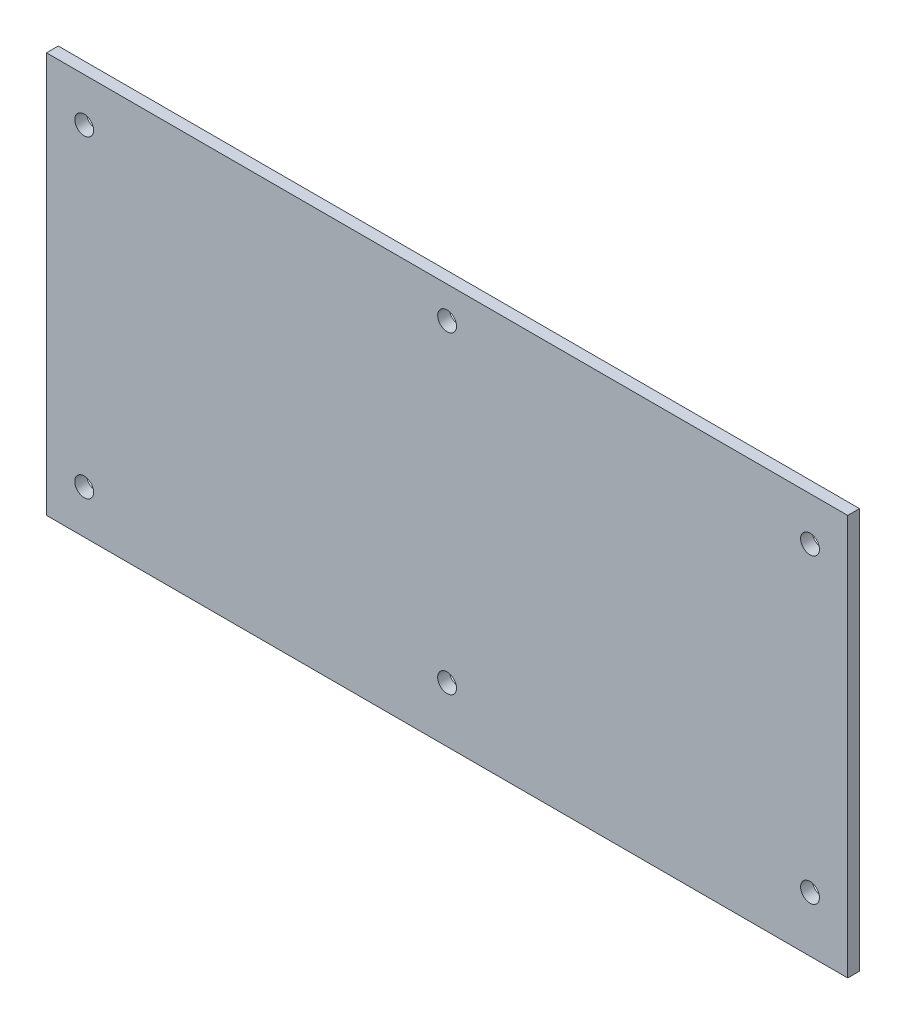
ISO-10303-21;
HEADER;
FILE_DESCRIPTION(('STEP AP214'),'2;1');
FILE_NAME('part.step','',(''),(''),'','','');
FILE_SCHEMA(('AUTOMOTIVE_DESIGN { 1 0 10303 214 1 1 1 1 }'));
ENDSEC;
DATA;
#1=APPLICATION_CONTEXT('core data for automotive mechanical design processes');
#2=APPLICATION_PROTOCOL_DEFINITION('international standard','automotive_design',2000,#1);
#3=PRODUCT_CONTEXT('',#1,'mechanical');
#4=PRODUCT('Part','Part','',(#3));
#5=PRODUCT_RELATED_PRODUCT_CATEGORY('part','',(#4));
#6=PRODUCT_DEFINITION_FORMATION('','',#4);
#7=PRODUCT_DEFINITION_CONTEXT('part definition',#1,'design');
#8=PRODUCT_DEFINITION('design','',#6,#7);
#9=PRODUCT_DEFINITION_SHAPE('','',#8);
#10=(LENGTH_UNIT() NAMED_UNIT(*) SI_UNIT(.MILLI.,.METRE.));
#11=(NAMED_UNIT(*) PLANE_ANGLE_UNIT() SI_UNIT($,.RADIAN.));
#12=(NAMED_UNIT(*) SI_UNIT($,.STERADIAN.) SOLID_ANGLE_UNIT());
#13=UNCERTAINTY_MEASURE_WITH_UNIT(LENGTH_MEASURE(1.E-05),#10,'distance_accuracy_value','');
#14=(GEOMETRIC_REPRESENTATION_CONTEXT(3) GLOBAL_UNCERTAINTY_ASSIGNED_CONTEXT((#13)) GLOBAL_UNIT_ASSIGNED_CONTEXT((#10,
#11,#12)) REPRESENTATION_CONTEXT('',''));
#15=CARTESIAN_POINT('',(0.,0.,0.));
#16=DIRECTION('',(0.,0.,1.));
#17=DIRECTION('',(1.,0.,0.));
#18=AXIS2_PLACEMENT_3D('',#15,#16,#17);
#19=CARTESIAN_POINT('',(0.,0.,5.));
#20=DIRECTION('',(0.,0.,-1.));
#21=DIRECTION('',(-1.,0.,0.));
#22=AXIS2_PLACEMENT_3D('',#19,#20,#21);
#23=PLANE('',#22);
#24=DIRECTION('',(0.,1.,0.));
#25=VECTOR('',#24,1.);
#26=CARTESIAN_POINT('',(137.134920634921,48.2341269841271,5.));
#27=LINE('',#26,#25);
#28=CARTESIAN_POINT('',(137.134920634921,-121.765873015873,5.));
#29=VERTEX_POINT('',#28);
#30=CARTESIAN_POINT('',(137.134920634921,48.2341269841271,5.));
#31=VERTEX_POINT('',#30);
#32=EDGE_CURVE('E86',#29,#31,#27,.T.);
#33=ORIENTED_EDGE('',*,*,#32,.T.);
#34=DIRECTION('',(-1.,0.,0.));
#35=VECTOR('',#34,1.);
#36=CARTESIAN_POINT('',(137.134920634921,48.2341269841271,5.));
#37=LINE('',#36,#35);
#38=CARTESIAN_POINT('',(-202.865079365079,48.234126984127,5.));
#39=VERTEX_POINT('',#38);
#40=EDGE_CURVE('E81',#31,#39,#37,.T.);
#41=ORIENTED_EDGE('',*,*,#40,.T.);
#42=DIRECTION('',(0.,-1.,0.));
#43=VECTOR('',#42,1.);
#44=CARTESIAN_POINT('',(-202.865079365079,48.234126984127,5.));
#45=LINE('',#44,#43);
#46=CARTESIAN_POINT('',(-202.865079365079,-121.765873015873,5.));
#47=VERTEX_POINT('',#46);
#48=EDGE_CURVE('E84',#39,#47,#45,.T.);
#49=ORIENTED_EDGE('',*,*,#48,.T.);
#50=DIRECTION('',(1.,0.,0.));
#51=VECTOR('',#50,1.);
#52=CARTESIAN_POINT('',(137.134920634921,-121.765873015873,5.));
#53=LINE('',#52,#51);
#54=EDGE_CURVE('E51',#47,#29,#53,.T.);
#55=ORIENTED_EDGE('',*,*,#54,.T.);
#56=EDGE_LOOP('',(#33,#41,#49,#55));
#57=FACE_BOUND('',#56,.T.);
#58=CARTESIAN_POINT('',(121.134920634921,29.7341269841271,5.));
#59=DIRECTION('',(0.,0.,1.));
#60=DIRECTION('',(1.,0.,0.));
#61=AXIS2_PLACEMENT_3D('',#58,#59,#60);
#62=CIRCLE('',#61,4.00000000000001);
#63=CARTESIAN_POINT('',(125.134920634921,29.7341269841271,5.));
#64=VERTEX_POINT('',#63);
#65=EDGE_CURVE('E101',#64,#64,#62,.T.);
#66=ORIENTED_EDGE('',*,*,#65,.F.);
#67=EDGE_LOOP('',(#66));
#68=FACE_BOUND('',#67,.T.);
#69=CARTESIAN_POINT('',(-32.8650793650793,34.734126984127,5.));
#70=DIRECTION('',(0.,0.,1.));
#71=DIRECTION('',(1.,0.,0.));
#72=AXIS2_PLACEMENT_3D('',#69,#70,#71);
#73=CIRCLE('',#72,4.);
#74=CARTESIAN_POINT('',(-28.8650793650793,34.734126984127,5.));
#75=VERTEX_POINT('',#74);
#76=EDGE_CURVE('E116',#75,#75,#73,.T.);
#77=ORIENTED_EDGE('',*,*,#76,.F.);
#78=EDGE_LOOP('',(#77));
#79=FACE_BOUND('',#78,.T.);
#80=CARTESIAN_POINT('',(-186.865079365079,29.734126984127,5.));
#81=DIRECTION('',(0.,0.,1.));
#82=DIRECTION('',(1.,0.,0.));
#83=AXIS2_PLACEMENT_3D('',#80,#81,#82);
#84=CIRCLE('',#83,3.99999999999999);
#85=CARTESIAN_POINT('',(-182.865079365079,29.734126984127,5.));
#86=VERTEX_POINT('',#85);
#87=EDGE_CURVE('E122',#86,#86,#84,.T.);
#88=ORIENTED_EDGE('',*,*,#87,.F.);
#89=EDGE_LOOP('',(#88));
#90=FACE_BOUND('',#89,.T.);
#91=CARTESIAN_POINT('',(-186.865079365079,-103.265873015873,5.));
#92=DIRECTION('',(0.,0.,1.));
#93=DIRECTION('',(1.,0.,0.));
#94=AXIS2_PLACEMENT_3D('',#91,#92,#93);
#95=CIRCLE('',#94,3.99999999999999);
#96=CARTESIAN_POINT('',(-182.865079365079,-103.265873015873,5.));
#97=VERTEX_POINT('',#96);
#98=EDGE_CURVE('E128',#97,#97,#95,.T.);
#99=ORIENTED_EDGE('',*,*,#98,.F.);
#100=EDGE_LOOP('',(#99));
#101=FACE_BOUND('',#100,.T.);
#102=CARTESIAN_POINT('',(-32.8650793650793,-98.265873015873,5.));
#103=DIRECTION('',(0.,0.,1.));
#104=DIRECTION('',(1.,0.,0.));
#105=AXIS2_PLACEMENT_3D('',#102,#103,#104);
#106=CIRCLE('',#105,4.);
#107=CARTESIAN_POINT('',(-28.8650793650793,-98.265873015873,5.));
#108=VERTEX_POINT('',#107);
#109=EDGE_CURVE('E134',#108,#108,#106,.T.);
#110=ORIENTED_EDGE('',*,*,#109,.F.);
#111=EDGE_LOOP('',(#110));
#112=FACE_BOUND('',#111,.T.);
#113=CARTESIAN_POINT('',(121.134920634921,-98.265873015873,5.));
#114=DIRECTION('',(0.,0.,1.));
#115=DIRECTION('',(1.,0.,0.));
#116=AXIS2_PLACEMENT_3D('',#113,#114,#115);
#117=CIRCLE('',#116,3.99999999999999);
#118=CARTESIAN_POINT('',(125.134920634921,-98.265873015873,5.));
#119=VERTEX_POINT('',#118);
#120=EDGE_CURVE('E140',#119,#119,#117,.T.);
#121=ORIENTED_EDGE('',*,*,#120,.F.);
#122=EDGE_LOOP('',(#121));
#123=FACE_BOUND('',#122,.T.);
#124=ADVANCED_FACE('F34',(#57,#68,#79,#90,#101,#112,#123),#23,.F.);
#125=CARTESIAN_POINT('',(0.,0.,0.));
#126=DIRECTION('',(0.,0.,-1.));
#127=DIRECTION('',(-1.,0.,0.));
#128=AXIS2_PLACEMENT_3D('',#125,#126,#127);
#129=PLANE('',#128);
#130=CARTESIAN_POINT('',(-32.8650793650793,-98.265873015873,0.));
#131=DIRECTION('',(0.,0.,1.));
#132=DIRECTION('',(1.,0.,0.));
#133=AXIS2_PLACEMENT_3D('',#130,#131,#132);
#134=CIRCLE('',#133,4.);
#135=CARTESIAN_POINT('',(-28.8650793650793,-98.265873015873,0.));
#136=VERTEX_POINT('',#135);
#137=EDGE_CURVE('E137',#136,#136,#134,.T.);
#138=ORIENTED_EDGE('',*,*,#137,.T.);
#139=EDGE_LOOP('',(#138));
#140=FACE_BOUND('',#139,.T.);
#141=CARTESIAN_POINT('',(-186.865079365079,29.734126984127,0.));
#142=DIRECTION('',(0.,0.,1.));
#143=DIRECTION('',(1.,0.,0.));
#144=AXIS2_PLACEMENT_3D('',#141,#142,#143);
#145=CIRCLE('',#144,3.99999999999999);
#146=CARTESIAN_POINT('',(-182.865079365079,29.734126984127,0.));
#147=VERTEX_POINT('',#146);
#148=EDGE_CURVE('E125',#147,#147,#145,.T.);
#149=ORIENTED_EDGE('',*,*,#148,.T.);
#150=EDGE_LOOP('',(#149));
#151=FACE_BOUND('',#150,.T.);
#152=CARTESIAN_POINT('',(121.134920634921,29.7341269841271,0.));
#153=DIRECTION('',(0.,0.,1.));
#154=DIRECTION('',(1.,0.,0.));
#155=AXIS2_PLACEMENT_3D('',#152,#153,#154);
#156=CIRCLE('',#155,4.00000000000001);
#157=CARTESIAN_POINT('',(125.134920634921,29.7341269841271,0.));
#158=VERTEX_POINT('',#157);
#159=EDGE_CURVE('E113',#158,#158,#156,.T.);
#160=ORIENTED_EDGE('',*,*,#159,.T.);
#161=EDGE_LOOP('',(#160));
#162=FACE_BOUND('',#161,.T.);
#163=DIRECTION('',(0.,1.,0.));
#164=VECTOR('',#163,1.);
#165=CARTESIAN_POINT('',(137.134920634921,48.2341269841271,0.));
#166=LINE('',#165,#164);
#167=CARTESIAN_POINT('',(137.134920634921,-121.765873015873,0.));
#168=VERTEX_POINT('',#167);
#169=CARTESIAN_POINT('',(137.134920634921,48.2341269841271,0.));
#170=VERTEX_POINT('',#169);
#171=EDGE_CURVE('E98',#168,#170,#166,.T.);
#172=ORIENTED_EDGE('',*,*,#171,.F.);
#173=DIRECTION('',(1.,0.,0.));
#174=VECTOR('',#173,1.);
#175=CARTESIAN_POINT('',(137.134920634921,-121.765873015873,0.));
#176=LINE('',#175,#174);
#177=CARTESIAN_POINT('',(-202.865079365079,-121.765873015873,0.));
#178=VERTEX_POINT('',#177);
#179=EDGE_CURVE('E74',#178,#168,#176,.T.);
#180=ORIENTED_EDGE('',*,*,#179,.F.);
#181=DIRECTION('',(0.,-1.,0.));
#182=VECTOR('',#181,1.);
#183=CARTESIAN_POINT('',(-202.865079365079,48.234126984127,0.));
#184=LINE('',#183,#182);
#185=CARTESIAN_POINT('',(-202.865079365079,48.234126984127,0.));
#186=VERTEX_POINT('',#185);
#187=EDGE_CURVE('E68',#186,#178,#184,.T.);
#188=ORIENTED_EDGE('',*,*,#187,.F.);
#189=DIRECTION('',(-1.,0.,0.));
#190=VECTOR('',#189,1.);
#191=CARTESIAN_POINT('',(137.134920634921,48.2341269841271,0.));
#192=LINE('',#191,#190);
#193=EDGE_CURVE('E90',#170,#186,#192,.T.);
#194=ORIENTED_EDGE('',*,*,#193,.F.);
#195=EDGE_LOOP('',(#172,#180,#188,#194));
#196=FACE_BOUND('',#195,.T.);
#197=CARTESIAN_POINT('',(-32.8650793650793,34.734126984127,0.));
#198=DIRECTION('',(0.,0.,1.));
#199=DIRECTION('',(1.,0.,0.));
#200=AXIS2_PLACEMENT_3D('',#197,#198,#199);
#201=CIRCLE('',#200,4.);
#202=CARTESIAN_POINT('',(-28.8650793650793,34.734126984127,0.));
#203=VERTEX_POINT('',#202);
#204=EDGE_CURVE('E119',#203,#203,#201,.T.);
#205=ORIENTED_EDGE('',*,*,#204,.T.);
#206=EDGE_LOOP('',(#205));
#207=FACE_BOUND('',#206,.T.);
#208=CARTESIAN_POINT('',(-186.865079365079,-103.265873015873,0.));
#209=DIRECTION('',(0.,0.,1.));
#210=DIRECTION('',(1.,0.,0.));
#211=AXIS2_PLACEMENT_3D('',#208,#209,#210);
#212=CIRCLE('',#211,3.99999999999999);
#213=CARTESIAN_POINT('',(-182.865079365079,-103.265873015873,0.));
#214=VERTEX_POINT('',#213);
#215=EDGE_CURVE('E131',#214,#214,#212,.T.);
#216=ORIENTED_EDGE('',*,*,#215,.T.);
#217=EDGE_LOOP('',(#216));
#218=FACE_BOUND('',#217,.T.);
#219=CARTESIAN_POINT('',(121.134920634921,-98.265873015873,0.));
#220=DIRECTION('',(0.,0.,1.));
#221=DIRECTION('',(1.,0.,0.));
#222=AXIS2_PLACEMENT_3D('',#219,#220,#221);
#223=CIRCLE('',#222,3.99999999999999);
#224=CARTESIAN_POINT('',(125.134920634921,-98.265873015873,0.));
#225=VERTEX_POINT('',#224);
#226=EDGE_CURVE('E143',#225,#225,#223,.T.);
#227=ORIENTED_EDGE('',*,*,#226,.T.);
#228=EDGE_LOOP('',(#227));
#229=FACE_BOUND('',#228,.T.);
#230=ADVANCED_FACE('F109',(#140,#151,#162,#196,#207,#218,#229),#129,.T.);
#231=CARTESIAN_POINT('',(137.134920634921,48.2341269841271,5.));
#232=DIRECTION('',(-1.,0.,0.));
#233=DIRECTION('',(0.,-1.,0.));
#234=AXIS2_PLACEMENT_3D('',#231,#232,#233);
#235=PLANE('',#234);
#236=ORIENTED_EDGE('',*,*,#171,.T.);
#237=DIRECTION('',(0.,0.,-1.));
#238=VECTOR('',#237,1.);
#239=CARTESIAN_POINT('',(137.134920634921,48.2341269841271,5.));
#240=LINE('',#239,#238);
#241=EDGE_CURVE('E11',#31,#170,#240,.T.);
#242=ORIENTED_EDGE('',*,*,#241,.F.);
#243=ORIENTED_EDGE('',*,*,#32,.F.);
#244=DIRECTION('',(0.,0.,-1.));
#245=VECTOR('',#244,1.);
#246=CARTESIAN_POINT('',(137.134920634921,-121.765873015873,5.));
#247=LINE('',#246,#245);
#248=EDGE_CURVE('E94',#29,#168,#247,.T.);
#249=ORIENTED_EDGE('',*,*,#248,.T.);
#250=EDGE_LOOP('',(#236,#242,#243,#249));
#251=FACE_BOUND('',#250,.T.);
#252=ADVANCED_FACE('F36',(#251),#235,.F.);
#253=CARTESIAN_POINT('',(137.134920634921,48.2341269841271,5.));
#254=DIRECTION('',(0.,-1.,0.));
#255=DIRECTION('',(1.,0.,0.));
#256=AXIS2_PLACEMENT_3D('',#253,#254,#255);
#257=PLANE('',#256);
#258=ORIENTED_EDGE('',*,*,#193,.T.);
#259=DIRECTION('',(0.,0.,-1.));
#260=VECTOR('',#259,1.);
#261=CARTESIAN_POINT('',(-202.865079365079,48.234126984127,5.));
#262=LINE('',#261,#260);
#263=EDGE_CURVE('E43',#39,#186,#262,.T.);
#264=ORIENTED_EDGE('',*,*,#263,.F.);
#265=ORIENTED_EDGE('',*,*,#40,.F.);
#266=ORIENTED_EDGE('',*,*,#241,.T.);
#267=EDGE_LOOP('',(#258,#264,#265,#266));
#268=FACE_BOUND('',#267,.T.);
#269=ADVANCED_FACE('F89',(#268),#257,.F.);
#270=CARTESIAN_POINT('',(-202.865079365079,48.234126984127,5.));
#271=DIRECTION('',(1.,0.,0.));
#272=DIRECTION('',(0.,1.,0.));
#273=AXIS2_PLACEMENT_3D('',#270,#271,#272);
#274=PLANE('',#273);
#275=ORIENTED_EDGE('',*,*,#187,.T.);
#276=DIRECTION('',(0.,0.,-1.));
#277=VECTOR('',#276,1.);
#278=CARTESIAN_POINT('',(-202.865079365079,-121.765873015873,5.));
#279=LINE('',#278,#277);
#280=EDGE_CURVE('E91',#47,#178,#279,.T.);
#281=ORIENTED_EDGE('',*,*,#280,.F.);
#282=ORIENTED_EDGE('',*,*,#48,.F.);
#283=ORIENTED_EDGE('',*,*,#263,.T.);
#284=EDGE_LOOP('',(#275,#281,#282,#283));
#285=FACE_BOUND('',#284,.T.);
#286=ADVANCED_FACE('F92',(#285),#274,.F.);
#287=CARTESIAN_POINT('',(137.134920634921,-121.765873015873,5.));
#288=DIRECTION('',(0.,1.,0.));
#289=DIRECTION('',(-1.,0.,0.));
#290=AXIS2_PLACEMENT_3D('',#287,#288,#289);
#291=PLANE('',#290);
#292=ORIENTED_EDGE('',*,*,#179,.T.);
#293=ORIENTED_EDGE('',*,*,#248,.F.);
#294=ORIENTED_EDGE('',*,*,#54,.F.);
#295=ORIENTED_EDGE('',*,*,#280,.T.);
#296=EDGE_LOOP('',(#292,#293,#294,#295));
#297=FACE_BOUND('',#296,.T.);
#298=ADVANCED_FACE('F106',(#297),#291,.F.);
#299=CARTESIAN_POINT('',(121.134920634921,29.7341269841271,5.));
#300=DIRECTION('',(0.,0.,-1.));
#301=DIRECTION('',(-1.,0.,0.));
#302=AXIS2_PLACEMENT_3D('',#299,#300,#301);
#303=CYLINDRICAL_SURFACE('',#302,4.00000000000001);
#304=ORIENTED_EDGE('',*,*,#65,.T.);
#305=EDGE_LOOP('',(#304));
#306=FACE_BOUND('',#305,.T.);
#307=ORIENTED_EDGE('',*,*,#159,.F.);
#308=EDGE_LOOP('',(#307));
#309=FACE_BOUND('',#308,.T.);
#310=ADVANCED_FACE('F160',(#306,#309),#303,.F.);
#311=CARTESIAN_POINT('',(-32.8650793650793,34.734126984127,5.));
#312=DIRECTION('',(0.,0.,-1.));
#313=DIRECTION('',(-1.,0.,0.));
#314=AXIS2_PLACEMENT_3D('',#311,#312,#313);
#315=CYLINDRICAL_SURFACE('',#314,4.);
#316=ORIENTED_EDGE('',*,*,#76,.T.);
#317=EDGE_LOOP('',(#316));
#318=FACE_BOUND('',#317,.T.);
#319=ORIENTED_EDGE('',*,*,#204,.F.);
#320=EDGE_LOOP('',(#319));
#321=FACE_BOUND('',#320,.T.);
#322=ADVANCED_FACE('F206',(#318,#321),#315,.F.);
#323=CARTESIAN_POINT('',(-186.865079365079,29.734126984127,5.));
#324=DIRECTION('',(0.,0.,-1.));
#325=DIRECTION('',(-1.,0.,0.));
#326=AXIS2_PLACEMENT_3D('',#323,#324,#325);
#327=CYLINDRICAL_SURFACE('',#326,3.99999999999999);
#328=ORIENTED_EDGE('',*,*,#87,.T.);
#329=EDGE_LOOP('',(#328));
#330=FACE_BOUND('',#329,.T.);
#331=ORIENTED_EDGE('',*,*,#148,.F.);
#332=EDGE_LOOP('',(#331));
#333=FACE_BOUND('',#332,.T.);
#334=ADVANCED_FACE('F214',(#330,#333),#327,.F.);
#335=CARTESIAN_POINT('',(-186.865079365079,-103.265873015873,5.));
#336=DIRECTION('',(0.,0.,-1.));
#337=DIRECTION('',(-1.,0.,0.));
#338=AXIS2_PLACEMENT_3D('',#335,#336,#337);
#339=CYLINDRICAL_SURFACE('',#338,3.99999999999999);
#340=ORIENTED_EDGE('',*,*,#98,.T.);
#341=EDGE_LOOP('',(#340));
#342=FACE_BOUND('',#341,.T.);
#343=ORIENTED_EDGE('',*,*,#215,.F.);
#344=EDGE_LOOP('',(#343));
#345=FACE_BOUND('',#344,.T.);
#346=ADVANCED_FACE('F222',(#342,#345),#339,.F.);
#347=CARTESIAN_POINT('',(-32.8650793650793,-98.265873015873,5.));
#348=DIRECTION('',(0.,0.,-1.));
#349=DIRECTION('',(-1.,0.,0.));
#350=AXIS2_PLACEMENT_3D('',#347,#348,#349);
#351=CYLINDRICAL_SURFACE('',#350,4.);
#352=ORIENTED_EDGE('',*,*,#109,.T.);
#353=EDGE_LOOP('',(#352));
#354=FACE_BOUND('',#353,.T.);
#355=ORIENTED_EDGE('',*,*,#137,.F.);
#356=EDGE_LOOP('',(#355));
#357=FACE_BOUND('',#356,.T.);
#358=ADVANCED_FACE('F231',(#354,#357),#351,.F.);
#359=CARTESIAN_POINT('',(121.134920634921,-98.265873015873,5.));
#360=DIRECTION('',(0.,0.,-1.));
#361=DIRECTION('',(-1.,0.,0.));
#362=AXIS2_PLACEMENT_3D('',#359,#360,#361);
#363=CYLINDRICAL_SURFACE('',#362,3.99999999999999);
#364=ORIENTED_EDGE('',*,*,#120,.T.);
#365=EDGE_LOOP('',(#364));
#366=FACE_BOUND('',#365,.T.);
#367=ORIENTED_EDGE('',*,*,#226,.F.);
#368=EDGE_LOOP('',(#367));
#369=FACE_BOUND('',#368,.T.);
#370=ADVANCED_FACE('F149',(#366,#369),#363,.F.);
#371=CLOSED_SHELL('',(#124,#230,#252,#269,#286,#298,#310,#322,#334,#346,#358,#370));
#372=MANIFOLD_SOLID_BREP('B2',#371);
#373=ADVANCED_BREP_SHAPE_REPRESENTATION('',(#18,#372),#14);
#374=SHAPE_DEFINITION_REPRESENTATION(#9,#373);
ENDSEC;
END-ISO-10303-21;
